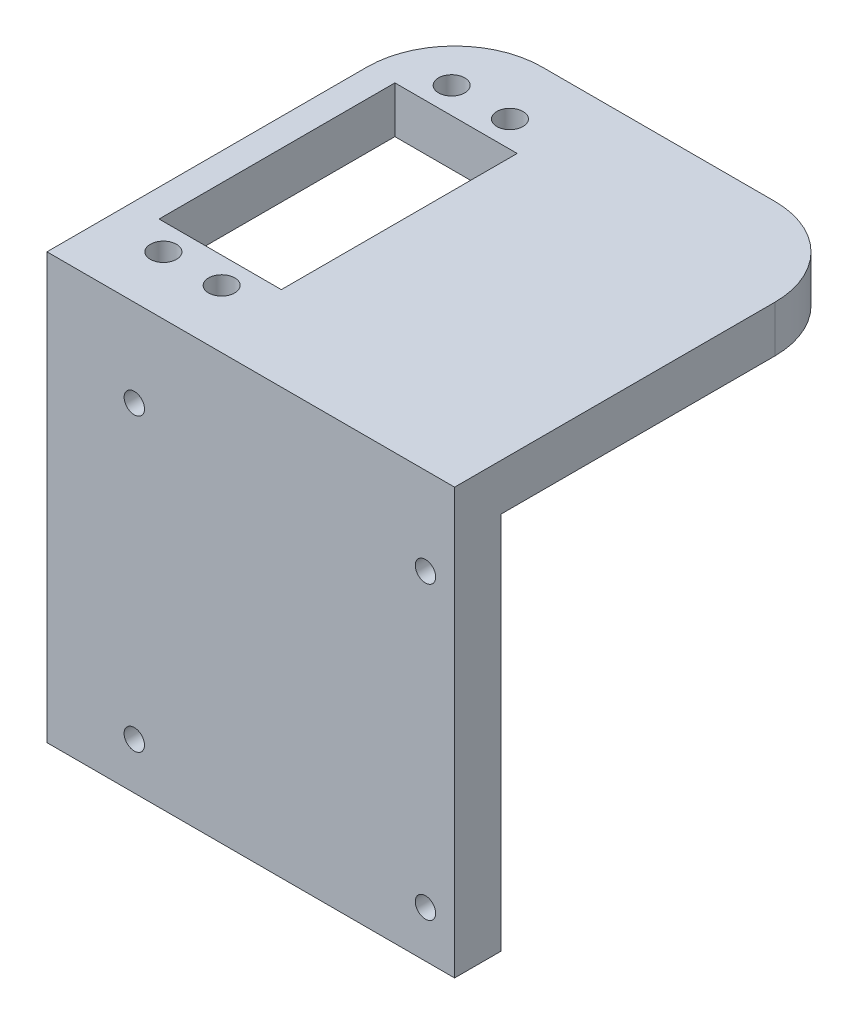
ISO-10303-21;
HEADER;
FILE_DESCRIPTION(('STEP AP214'),'2;1');
FILE_NAME('part.step','',(''),(''),'','','');
FILE_SCHEMA(('AUTOMOTIVE_DESIGN { 1 0 10303 214 1 1 1 1 }'));
ENDSEC;
DATA;
#1=APPLICATION_CONTEXT('core data for automotive mechanical design processes');
#2=APPLICATION_PROTOCOL_DEFINITION('international standard','automotive_design',2000,#1);
#3=PRODUCT_CONTEXT('',#1,'mechanical');
#4=PRODUCT('Part','Part','',(#3));
#5=PRODUCT_RELATED_PRODUCT_CATEGORY('part','',(#4));
#6=PRODUCT_DEFINITION_FORMATION('','',#4);
#7=PRODUCT_DEFINITION_CONTEXT('part definition',#1,'design');
#8=PRODUCT_DEFINITION('design','',#6,#7);
#9=PRODUCT_DEFINITION_SHAPE('','',#8);
#10=(LENGTH_UNIT() NAMED_UNIT(*) SI_UNIT(.MILLI.,.METRE.));
#11=(NAMED_UNIT(*) PLANE_ANGLE_UNIT() SI_UNIT($,.RADIAN.));
#12=(NAMED_UNIT(*) SI_UNIT($,.STERADIAN.) SOLID_ANGLE_UNIT());
#13=UNCERTAINTY_MEASURE_WITH_UNIT(LENGTH_MEASURE(1.E-05),#10,'distance_accuracy_value','');
#14=(GEOMETRIC_REPRESENTATION_CONTEXT(3) GLOBAL_UNCERTAINTY_ASSIGNED_CONTEXT((#13)) GLOBAL_UNIT_ASSIGNED_CONTEXT((#10,
#11,#12)) REPRESENTATION_CONTEXT('',''));
#15=CARTESIAN_POINT('',(0.,0.,0.));
#16=DIRECTION('',(0.,0.,1.));
#17=DIRECTION('',(1.,0.,0.));
#18=AXIS2_PLACEMENT_3D('',#15,#16,#17);
#19=CARTESIAN_POINT('',(50.,-7.,34.5));
#20=DIRECTION('',(0.,0.,-1.));
#21=DIRECTION('',(-1.,0.,0.));
#22=AXIS2_PLACEMENT_3D('',#19,#20,#21);
#23=CYLINDRICAL_SURFACE('',#22,1.75);
#24=CARTESIAN_POINT('',(50.,-7.,32.5));
#25=DIRECTION('',(0.,0.,-1.));
#26=DIRECTION('',(-1.,0.,0.));
#27=AXIS2_PLACEMENT_3D('',#24,#25,#26);
#28=CIRCLE('',#27,1.75);
#29=CARTESIAN_POINT('',(48.25,-7.,32.5));
#30=VERTEX_POINT('',#29);
#31=EDGE_CURVE('E240',#30,#30,#28,.T.);
#32=ORIENTED_EDGE('',*,*,#31,.F.);
#33=EDGE_LOOP('',(#32));
#34=FACE_BOUND('',#33,.T.);
#35=CARTESIAN_POINT('',(50.,-7.,27.5));
#36=DIRECTION('',(0.,0.,-1.));
#37=DIRECTION('',(-1.,0.,0.));
#38=AXIS2_PLACEMENT_3D('',#35,#36,#37);
#39=CIRCLE('',#38,1.75);
#40=CARTESIAN_POINT('',(48.25,-7.,27.5));
#41=VERTEX_POINT('',#40);
#42=EDGE_CURVE('E238',#41,#41,#39,.F.);
#43=ORIENTED_EDGE('',*,*,#42,.F.);
#44=EDGE_LOOP('',(#43));
#45=FACE_BOUND('',#44,.T.);
#46=ADVANCED_FACE('F39',(#34,#45),#23,.F.);
#47=CARTESIAN_POINT('',(0.,-57.,34.5));
#48=DIRECTION('',(0.,0.,-1.));
#49=DIRECTION('',(-1.,0.,0.));
#50=AXIS2_PLACEMENT_3D('',#47,#48,#49);
#51=CYLINDRICAL_SURFACE('',#50,1.75);
#52=CARTESIAN_POINT('',(0.,-57.,32.5));
#53=DIRECTION('',(0.,0.,-1.));
#54=DIRECTION('',(-1.,0.,0.));
#55=AXIS2_PLACEMENT_3D('',#52,#53,#54);
#56=CIRCLE('',#55,1.75);
#57=CARTESIAN_POINT('',(-1.75000000000002,-57.,32.5));
#58=VERTEX_POINT('',#57);
#59=EDGE_CURVE('E244',#58,#58,#56,.T.);
#60=ORIENTED_EDGE('',*,*,#59,.F.);
#61=EDGE_LOOP('',(#60));
#62=FACE_BOUND('',#61,.T.);
#63=CARTESIAN_POINT('',(0.,-57.,27.5));
#64=DIRECTION('',(0.,0.,-1.));
#65=DIRECTION('',(-1.,0.,0.));
#66=AXIS2_PLACEMENT_3D('',#63,#64,#65);
#67=CIRCLE('',#66,1.75);
#68=CARTESIAN_POINT('',(-1.75000000000002,-57.,27.5));
#69=VERTEX_POINT('',#68);
#70=EDGE_CURVE('E236',#69,#69,#67,.F.);
#71=ORIENTED_EDGE('',*,*,#70,.F.);
#72=EDGE_LOOP('',(#71));
#73=FACE_BOUND('',#72,.T.);
#74=ADVANCED_FACE('F293',(#62,#73),#51,.F.);
#75=CARTESIAN_POINT('',(50.,-57.,34.5));
#76=DIRECTION('',(0.,0.,-1.));
#77=DIRECTION('',(-1.,0.,0.));
#78=AXIS2_PLACEMENT_3D('',#75,#76,#77);
#79=CYLINDRICAL_SURFACE('',#78,1.75);
#80=CARTESIAN_POINT('',(50.,-57.,32.5));
#81=DIRECTION('',(0.,0.,-1.));
#82=DIRECTION('',(-1.,0.,0.));
#83=AXIS2_PLACEMENT_3D('',#80,#81,#82);
#84=CIRCLE('',#83,1.75);
#85=CARTESIAN_POINT('',(48.25,-57.,32.5));
#86=VERTEX_POINT('',#85);
#87=EDGE_CURVE('E249',#86,#86,#84,.T.);
#88=ORIENTED_EDGE('',*,*,#87,.F.);
#89=EDGE_LOOP('',(#88));
#90=FACE_BOUND('',#89,.T.);
#91=CARTESIAN_POINT('',(50.,-57.,27.5));
#92=DIRECTION('',(0.,0.,-1.));
#93=DIRECTION('',(-1.,0.,0.));
#94=AXIS2_PLACEMENT_3D('',#91,#92,#93);
#95=CIRCLE('',#94,1.75);
#96=CARTESIAN_POINT('',(48.25,-57.,27.5));
#97=VERTEX_POINT('',#96);
#98=EDGE_CURVE('E232',#97,#97,#95,.F.);
#99=ORIENTED_EDGE('',*,*,#98,.F.);
#100=EDGE_LOOP('',(#99));
#101=FACE_BOUND('',#100,.T.);
#102=ADVANCED_FACE('F300',(#90,#101),#79,.F.);
#103=CARTESIAN_POINT('',(0.,-7.,34.5));
#104=DIRECTION('',(0.,0.,-1.));
#105=DIRECTION('',(-1.,0.,0.));
#106=AXIS2_PLACEMENT_3D('',#103,#104,#105);
#107=CYLINDRICAL_SURFACE('',#106,1.75);
#108=CARTESIAN_POINT('',(0.,-7.,32.5));
#109=DIRECTION('',(0.,0.,-1.));
#110=DIRECTION('',(-1.,0.,0.));
#111=AXIS2_PLACEMENT_3D('',#108,#109,#110);
#112=CIRCLE('',#111,1.75);
#113=CARTESIAN_POINT('',(-1.75000000000001,-7.,32.5));
#114=VERTEX_POINT('',#113);
#115=EDGE_CURVE('E257',#114,#114,#112,.T.);
#116=ORIENTED_EDGE('',*,*,#115,.F.);
#117=EDGE_LOOP('',(#116));
#118=FACE_BOUND('',#117,.T.);
#119=CARTESIAN_POINT('',(0.,-7.,27.5));
#120=DIRECTION('',(0.,0.,-1.));
#121=DIRECTION('',(-1.,0.,0.));
#122=AXIS2_PLACEMENT_3D('',#119,#120,#121);
#123=CIRCLE('',#122,1.75);
#124=CARTESIAN_POINT('',(-1.75000000000001,-7.,27.5));
#125=VERTEX_POINT('',#124);
#126=EDGE_CURVE('E229',#125,#125,#123,.F.);
#127=ORIENTED_EDGE('',*,*,#126,.F.);
#128=EDGE_LOOP('',(#127));
#129=FACE_BOUND('',#128,.T.);
#130=ADVANCED_FACE('F320',(#118,#129),#107,.F.);
#131=CARTESIAN_POINT('',(0.,0.,0.));
#132=DIRECTION('',(0.,1.,0.));
#133=DIRECTION('',(0.,0.,1.));
#134=AXIS2_PLACEMENT_3D('',#131,#132,#133);
#135=PLANE('',#134);
#136=CARTESIAN_POINT('',(5.,0.,-27.));
#137=DIRECTION('',(0.,1.,0.));
#138=DIRECTION('',(0.,0.,1.));
#139=AXIS2_PLACEMENT_3D('',#136,#137,#138);
#140=CIRCLE('',#139,2.25);
#141=CARTESIAN_POINT('',(5.,0.,-24.75));
#142=VERTEX_POINT('',#141);
#143=EDGE_CURVE('E606',#142,#142,#140,.T.);
#144=ORIENTED_EDGE('',*,*,#143,.T.);
#145=EDGE_LOOP('',(#144));
#146=FACE_BOUND('',#145,.T.);
#147=CARTESIAN_POINT('',(-5.,0.,-27.));
#148=DIRECTION('',(0.,1.,0.));
#149=DIRECTION('',(0.,0.,1.));
#150=AXIS2_PLACEMENT_3D('',#147,#148,#149);
#151=CIRCLE('',#150,2.25);
#152=CARTESIAN_POINT('',(-5.,0.,-24.75));
#153=VERTEX_POINT('',#152);
#154=EDGE_CURVE('E608',#153,#153,#151,.T.);
#155=ORIENTED_EDGE('',*,*,#154,.T.);
#156=EDGE_LOOP('',(#155));
#157=FACE_BOUND('',#156,.T.);
#158=DIRECTION('',(-1.,0.,0.));
#159=VECTOR('',#158,1.);
#160=CARTESIAN_POINT('',(0.,0.,-22.5));
#161=LINE('',#160,#159);
#162=CARTESIAN_POINT('',(10.75,0.,-22.5));
#163=VERTEX_POINT('',#162);
#164=CARTESIAN_POINT('',(-10.25,0.,-22.5));
#165=VERTEX_POINT('',#164);
#166=EDGE_CURVE('E640',#163,#165,#161,.T.);
#167=ORIENTED_EDGE('',*,*,#166,.T.);
#168=DIRECTION('',(0.,0.,1.));
#169=VECTOR('',#168,1.);
#170=CARTESIAN_POINT('',(-10.25,0.,0.));
#171=LINE('',#170,#169);
#172=CARTESIAN_POINT('',(-10.25,0.,18.));
#173=VERTEX_POINT('',#172);
#174=EDGE_CURVE('E643',#165,#173,#171,.T.);
#175=ORIENTED_EDGE('',*,*,#174,.T.);
#176=DIRECTION('',(1.,0.,0.));
#177=VECTOR('',#176,1.);
#178=CARTESIAN_POINT('',(0.,0.,18.));
#179=LINE('',#178,#177);
#180=CARTESIAN_POINT('',(10.75,0.,18.));
#181=VERTEX_POINT('',#180);
#182=EDGE_CURVE('E628',#173,#181,#179,.T.);
#183=ORIENTED_EDGE('',*,*,#182,.T.);
#184=DIRECTION('',(0.,0.,-1.));
#185=VECTOR('',#184,1.);
#186=CARTESIAN_POINT('',(10.75,0.,0.));
#187=LINE('',#186,#185);
#188=EDGE_CURVE('E637',#181,#163,#187,.T.);
#189=ORIENTED_EDGE('',*,*,#188,.T.);
#190=EDGE_LOOP('',(#167,#175,#183,#189));
#191=FACE_BOUND('',#190,.T.);
#192=DIRECTION('',(0.,0.,1.));
#193=VECTOR('',#192,1.);
#194=CARTESIAN_POINT('',(-15.,0.,-37.5));
#195=LINE('',#194,#193);
#196=CARTESIAN_POINT('',(-15.,0.,-22.5));
#197=VERTEX_POINT('',#196);
#198=CARTESIAN_POINT('',(-15.,0.,24.5));
#199=VERTEX_POINT('',#198);
#200=EDGE_CURVE('E202',#197,#199,#195,.T.);
#201=ORIENTED_EDGE('',*,*,#200,.F.);
#202=CARTESIAN_POINT('',(0.,0.,-22.5));
#203=DIRECTION('',(0.,1.,0.));
#204=DIRECTION('',(0.,0.,1.));
#205=AXIS2_PLACEMENT_3D('',#202,#203,#204);
#206=CIRCLE('',#205,15.);
#207=CARTESIAN_POINT('',(0.,0.,-37.5));
#208=VERTEX_POINT('',#207);
#209=EDGE_CURVE('E61',#197,#208,#206,.F.);
#210=ORIENTED_EDGE('',*,*,#209,.T.);
#211=DIRECTION('',(-1.,0.,0.));
#212=VECTOR('',#211,1.);
#213=CARTESIAN_POINT('',(-15.,0.,-37.5));
#214=LINE('',#213,#212);
#215=CARTESIAN_POINT('',(40.,0.,-37.5));
#216=VERTEX_POINT('',#215);
#217=EDGE_CURVE('E217',#216,#208,#214,.T.);
#218=ORIENTED_EDGE('',*,*,#217,.F.);
#219=CARTESIAN_POINT('',(40.,0.,-22.5));
#220=DIRECTION('',(0.,1.,0.));
#221=DIRECTION('',(0.,0.,1.));
#222=AXIS2_PLACEMENT_3D('',#219,#220,#221);
#223=CIRCLE('',#222,15.);
#224=CARTESIAN_POINT('',(55.,0.,-22.5));
#225=VERTEX_POINT('',#224);
#226=EDGE_CURVE('E188',#216,#225,#223,.F.);
#227=ORIENTED_EDGE('',*,*,#226,.T.);
#228=DIRECTION('',(0.,0.,-1.));
#229=VECTOR('',#228,1.);
#230=CARTESIAN_POINT('',(55.,0.,-37.5));
#231=LINE('',#230,#229);
#232=CARTESIAN_POINT('',(55.,0.,24.5));
#233=VERTEX_POINT('',#232);
#234=EDGE_CURVE('E213',#233,#225,#231,.T.);
#235=ORIENTED_EDGE('',*,*,#234,.F.);
#236=DIRECTION('',(1.,0.,0.));
#237=VECTOR('',#236,1.);
#238=CARTESIAN_POINT('',(-15.,0.,24.5));
#239=LINE('',#238,#237);
#240=CARTESIAN_POINT('',(6.03077640640444,0.,24.5));
#241=VERTEX_POINT('',#240);
#242=EDGE_CURVE('E260',#241,#233,#239,.T.);
#243=ORIENTED_EDGE('',*,*,#242,.F.);
#244=CARTESIAN_POINT('',(5.,0.,22.5));
#245=DIRECTION('',(0.,1.,0.));
#246=DIRECTION('',(0.,0.,1.));
#247=AXIS2_PLACEMENT_3D('',#244,#245,#246);
#248=CIRCLE('',#247,2.25);
#249=CARTESIAN_POINT('',(3.96922359359557,0.,24.5));
#250=VERTEX_POINT('',#249);
#251=EDGE_CURVE('E700',#241,#250,#248,.T.);
#252=ORIENTED_EDGE('',*,*,#251,.T.);
#253=CARTESIAN_POINT('',(-3.96922359359557,0.,24.5));
#254=VERTEX_POINT('',#253);
#255=EDGE_CURVE('E173',#254,#250,#239,.T.);
#256=ORIENTED_EDGE('',*,*,#255,.F.);
#257=CARTESIAN_POINT('',(-5.,0.,22.5));
#258=DIRECTION('',(0.,1.,0.));
#259=DIRECTION('',(0.,0.,1.));
#260=AXIS2_PLACEMENT_3D('',#257,#258,#259);
#261=CIRCLE('',#260,2.25);
#262=CARTESIAN_POINT('',(-6.03077640640443,0.,24.5));
#263=VERTEX_POINT('',#262);
#264=EDGE_CURVE('E613',#254,#263,#261,.T.);
#265=ORIENTED_EDGE('',*,*,#264,.T.);
#266=EDGE_CURVE('E211',#199,#263,#239,.T.);
#267=ORIENTED_EDGE('',*,*,#266,.F.);
#268=EDGE_LOOP('',(#201,#210,#218,#227,#235,#243,#252,#256,#265,#267));
#269=FACE_BOUND('',#268,.T.);
#270=ADVANCED_FACE('F208',(#146,#157,#191,#269),#135,.F.);
#271=CARTESIAN_POINT('',(-15.,8.,-37.5));
#272=DIRECTION('',(1.,0.,0.));
#273=DIRECTION('',(0.,0.,-1.));
#274=AXIS2_PLACEMENT_3D('',#271,#272,#273);
#275=PLANE('',#274);
#276=DIRECTION('',(0.,0.,1.));
#277=VECTOR('',#276,1.);
#278=CARTESIAN_POINT('',(-15.,8.,-37.5));
#279=LINE('',#278,#277);
#280=CARTESIAN_POINT('',(-15.,8.,-22.5));
#281=VERTEX_POINT('',#280);
#282=CARTESIAN_POINT('',(-15.,8.,32.5));
#283=VERTEX_POINT('',#282);
#284=EDGE_CURVE('E205',#281,#283,#279,.T.);
#285=ORIENTED_EDGE('',*,*,#284,.F.);
#286=DIRECTION('',(0.,-1.,0.));
#287=VECTOR('',#286,1.);
#288=CARTESIAN_POINT('',(-15.,8.,-22.5));
#289=LINE('',#288,#287);
#290=EDGE_CURVE('E194',#281,#197,#289,.T.);
#291=ORIENTED_EDGE('',*,*,#290,.T.);
#292=ORIENTED_EDGE('',*,*,#200,.T.);
#293=DIRECTION('',(0.,1.,0.));
#294=VECTOR('',#293,1.);
#295=CARTESIAN_POINT('',(-15.,-65.,24.5));
#296=LINE('',#295,#294);
#297=CARTESIAN_POINT('',(-15.,-65.,24.5));
#298=VERTEX_POINT('',#297);
#299=EDGE_CURVE('E214',#298,#199,#296,.T.);
#300=ORIENTED_EDGE('',*,*,#299,.F.);
#301=DIRECTION('',(0.,0.,-1.));
#302=VECTOR('',#301,1.);
#303=CARTESIAN_POINT('',(-15.,-65.,32.5));
#304=LINE('',#303,#302);
#305=CARTESIAN_POINT('',(-15.,-65.,32.5));
#306=VERTEX_POINT('',#305);
#307=EDGE_CURVE('E261',#306,#298,#304,.T.);
#308=ORIENTED_EDGE('',*,*,#307,.F.);
#309=DIRECTION('',(0.,-1.,0.));
#310=VECTOR('',#309,1.);
#311=CARTESIAN_POINT('',(-15.,8.,32.5));
#312=LINE('',#311,#310);
#313=EDGE_CURVE('E160',#283,#306,#312,.T.);
#314=ORIENTED_EDGE('',*,*,#313,.F.);
#315=EDGE_LOOP('',(#285,#291,#292,#300,#308,#314));
#316=FACE_BOUND('',#315,.T.);
#317=ADVANCED_FACE('F200',(#316),#275,.F.);
#318=CARTESIAN_POINT('',(-15.,8.,32.5));
#319=DIRECTION('',(0.,0.,-1.));
#320=DIRECTION('',(-1.,0.,0.));
#321=AXIS2_PLACEMENT_3D('',#318,#319,#320);
#322=PLANE('',#321);
#323=ORIENTED_EDGE('',*,*,#115,.T.);
#324=EDGE_LOOP('',(#323));
#325=FACE_BOUND('',#324,.T.);
#326=ORIENTED_EDGE('',*,*,#87,.T.);
#327=EDGE_LOOP('',(#326));
#328=FACE_BOUND('',#327,.T.);
#329=ORIENTED_EDGE('',*,*,#59,.T.);
#330=EDGE_LOOP('',(#329));
#331=FACE_BOUND('',#330,.T.);
#332=ORIENTED_EDGE('',*,*,#31,.T.);
#333=EDGE_LOOP('',(#332));
#334=FACE_BOUND('',#333,.T.);
#335=ORIENTED_EDGE('',*,*,#313,.T.);
#336=DIRECTION('',(-1.,0.,0.));
#337=VECTOR('',#336,1.);
#338=CARTESIAN_POINT('',(-15.,-65.,32.5));
#339=LINE('',#338,#337);
#340=CARTESIAN_POINT('',(55.,-65.,32.5));
#341=VERTEX_POINT('',#340);
#342=EDGE_CURVE('E269',#341,#306,#339,.T.);
#343=ORIENTED_EDGE('',*,*,#342,.F.);
#344=DIRECTION('',(0.,-1.,0.));
#345=VECTOR('',#344,1.);
#346=CARTESIAN_POINT('',(55.,8.,32.5));
#347=LINE('',#346,#345);
#348=CARTESIAN_POINT('',(55.,8.,32.5));
#349=VERTEX_POINT('',#348);
#350=EDGE_CURVE('E226',#349,#341,#347,.T.);
#351=ORIENTED_EDGE('',*,*,#350,.F.);
#352=DIRECTION('',(1.,0.,0.));
#353=VECTOR('',#352,1.);
#354=CARTESIAN_POINT('',(-15.,8.,32.5));
#355=LINE('',#354,#353);
#356=EDGE_CURVE('E276',#283,#349,#355,.T.);
#357=ORIENTED_EDGE('',*,*,#356,.F.);
#358=EDGE_LOOP('',(#335,#343,#351,#357));
#359=FACE_BOUND('',#358,.T.);
#360=ADVANCED_FACE('F327',(#325,#328,#331,#334,#359),#322,.F.);
#361=CARTESIAN_POINT('',(55.,8.,-37.5));
#362=DIRECTION('',(-1.,0.,0.));
#363=DIRECTION('',(0.,0.,1.));
#364=AXIS2_PLACEMENT_3D('',#361,#362,#363);
#365=PLANE('',#364);
#366=ORIENTED_EDGE('',*,*,#234,.T.);
#367=DIRECTION('',(0.,-1.,0.));
#368=VECTOR('',#367,1.);
#369=CARTESIAN_POINT('',(55.,8.,-22.5));
#370=LINE('',#369,#368);
#371=CARTESIAN_POINT('',(55.,8.,-22.5));
#372=VERTEX_POINT('',#371);
#373=EDGE_CURVE('E190',#225,#372,#370,.F.);
#374=ORIENTED_EDGE('',*,*,#373,.T.);
#375=DIRECTION('',(0.,0.,-1.));
#376=VECTOR('',#375,1.);
#377=CARTESIAN_POINT('',(55.,8.,-37.5));
#378=LINE('',#377,#376);
#379=EDGE_CURVE('E277',#349,#372,#378,.T.);
#380=ORIENTED_EDGE('',*,*,#379,.F.);
#381=ORIENTED_EDGE('',*,*,#350,.T.);
#382=DIRECTION('',(0.,0.,1.));
#383=VECTOR('',#382,1.);
#384=CARTESIAN_POINT('',(55.,-65.,32.5));
#385=LINE('',#384,#383);
#386=CARTESIAN_POINT('',(55.,-65.,24.5));
#387=VERTEX_POINT('',#386);
#388=EDGE_CURVE('E266',#387,#341,#385,.T.);
#389=ORIENTED_EDGE('',*,*,#388,.F.);
#390=DIRECTION('',(0.,1.,0.));
#391=VECTOR('',#390,1.);
#392=CARTESIAN_POINT('',(55.,-65.,24.5));
#393=LINE('',#392,#391);
#394=EDGE_CURVE('E219',#387,#233,#393,.T.);
#395=ORIENTED_EDGE('',*,*,#394,.T.);
#396=EDGE_LOOP('',(#366,#374,#380,#381,#389,#395));
#397=FACE_BOUND('',#396,.T.);
#398=ADVANCED_FACE('F324',(#397),#365,.F.);
#399=CARTESIAN_POINT('',(-15.,8.,-37.5));
#400=DIRECTION('',(0.,0.,1.));
#401=DIRECTION('',(1.,0.,0.));
#402=AXIS2_PLACEMENT_3D('',#399,#400,#401);
#403=PLANE('',#402);
#404=ORIENTED_EDGE('',*,*,#217,.T.);
#405=DIRECTION('',(0.,-1.,0.));
#406=VECTOR('',#405,1.);
#407=CARTESIAN_POINT('',(0.,8.,-37.5));
#408=LINE('',#407,#406);
#409=CARTESIAN_POINT('',(0.,8.,-37.5));
#410=VERTEX_POINT('',#409);
#411=EDGE_CURVE('E47',#208,#410,#408,.F.);
#412=ORIENTED_EDGE('',*,*,#411,.T.);
#413=DIRECTION('',(-1.,0.,0.));
#414=VECTOR('',#413,1.);
#415=CARTESIAN_POINT('',(-15.,8.,-37.5));
#416=LINE('',#415,#414);
#417=CARTESIAN_POINT('',(40.,8.,-37.5));
#418=VERTEX_POINT('',#417);
#419=EDGE_CURVE('E222',#418,#410,#416,.T.);
#420=ORIENTED_EDGE('',*,*,#419,.F.);
#421=DIRECTION('',(0.,-1.,0.));
#422=VECTOR('',#421,1.);
#423=CARTESIAN_POINT('',(40.,8.,-37.5));
#424=LINE('',#423,#422);
#425=EDGE_CURVE('E185',#418,#216,#424,.T.);
#426=ORIENTED_EDGE('',*,*,#425,.T.);
#427=EDGE_LOOP('',(#404,#412,#420,#426));
#428=FACE_BOUND('',#427,.T.);
#429=ADVANCED_FACE('F316',(#428),#403,.F.);
#430=CARTESIAN_POINT('',(0.,8.,0.));
#431=DIRECTION('',(0.,1.,0.));
#432=DIRECTION('',(0.,0.,1.));
#433=AXIS2_PLACEMENT_3D('',#430,#431,#432);
#434=PLANE('',#433);
#435=CARTESIAN_POINT('',(5.,8.,-27.));
#436=DIRECTION('',(0.,1.,0.));
#437=DIRECTION('',(0.,0.,1.));
#438=AXIS2_PLACEMENT_3D('',#435,#436,#437);
#439=CIRCLE('',#438,2.25);
#440=CARTESIAN_POINT('',(5.,8.,-24.75));
#441=VERTEX_POINT('',#440);
#442=EDGE_CURVE('E603',#441,#441,#439,.T.);
#443=ORIENTED_EDGE('',*,*,#442,.F.);
#444=EDGE_LOOP('',(#443));
#445=FACE_BOUND('',#444,.T.);
#446=CARTESIAN_POINT('',(-5.,8.,22.5));
#447=DIRECTION('',(0.,1.,0.));
#448=DIRECTION('',(0.,0.,1.));
#449=AXIS2_PLACEMENT_3D('',#446,#447,#448);
#450=CIRCLE('',#449,2.25);
#451=CARTESIAN_POINT('',(-5.,8.,24.75));
#452=VERTEX_POINT('',#451);
#453=EDGE_CURVE('E707',#452,#452,#450,.T.);
#454=ORIENTED_EDGE('',*,*,#453,.F.);
#455=EDGE_LOOP('',(#454));
#456=FACE_BOUND('',#455,.T.);
#457=CARTESIAN_POINT('',(5.,8.,22.5));
#458=DIRECTION('',(0.,1.,0.));
#459=DIRECTION('',(0.,0.,1.));
#460=AXIS2_PLACEMENT_3D('',#457,#458,#459);
#461=CIRCLE('',#460,2.25);
#462=CARTESIAN_POINT('',(5.,8.,24.75));
#463=VERTEX_POINT('',#462);
#464=EDGE_CURVE('E166',#463,#463,#461,.T.);
#465=ORIENTED_EDGE('',*,*,#464,.F.);
#466=EDGE_LOOP('',(#465));
#467=FACE_BOUND('',#466,.T.);
#468=CARTESIAN_POINT('',(-5.,8.,-27.));
#469=DIRECTION('',(0.,1.,0.));
#470=DIRECTION('',(0.,0.,1.));
#471=AXIS2_PLACEMENT_3D('',#468,#469,#470);
#472=CIRCLE('',#471,2.25);
#473=CARTESIAN_POINT('',(-5.,8.,-24.75));
#474=VERTEX_POINT('',#473);
#475=EDGE_CURVE('E702',#474,#474,#472,.T.);
#476=ORIENTED_EDGE('',*,*,#475,.F.);
#477=EDGE_LOOP('',(#476));
#478=FACE_BOUND('',#477,.T.);
#479=DIRECTION('',(0.,0.,1.));
#480=VECTOR('',#479,1.);
#481=CARTESIAN_POINT('',(-10.25,8.,-22.5));
#482=LINE('',#481,#480);
#483=CARTESIAN_POINT('',(-10.25,8.,-22.5));
#484=VERTEX_POINT('',#483);
#485=CARTESIAN_POINT('',(-10.25,8.,18.));
#486=VERTEX_POINT('',#485);
#487=EDGE_CURVE('E607',#484,#486,#482,.T.);
#488=ORIENTED_EDGE('',*,*,#487,.F.);
#489=DIRECTION('',(-1.,0.,0.));
#490=VECTOR('',#489,1.);
#491=CARTESIAN_POINT('',(-10.25,8.,-22.5));
#492=LINE('',#491,#490);
#493=CARTESIAN_POINT('',(10.75,8.,-22.5));
#494=VERTEX_POINT('',#493);
#495=EDGE_CURVE('E622',#494,#484,#492,.T.);
#496=ORIENTED_EDGE('',*,*,#495,.F.);
#497=DIRECTION('',(0.,0.,-1.));
#498=VECTOR('',#497,1.);
#499=CARTESIAN_POINT('',(10.75,8.,-22.5));
#500=LINE('',#499,#498);
#501=CARTESIAN_POINT('',(10.75,8.,18.));
#502=VERTEX_POINT('',#501);
#503=EDGE_CURVE('E619',#502,#494,#500,.T.);
#504=ORIENTED_EDGE('',*,*,#503,.F.);
#505=DIRECTION('',(1.,0.,0.));
#506=VECTOR('',#505,1.);
#507=CARTESIAN_POINT('',(-10.25,8.,18.));
#508=LINE('',#507,#506);
#509=EDGE_CURVE('E610',#486,#502,#508,.T.);
#510=ORIENTED_EDGE('',*,*,#509,.F.);
#511=EDGE_LOOP('',(#488,#496,#504,#510));
#512=FACE_BOUND('',#511,.T.);
#513=ORIENTED_EDGE('',*,*,#419,.T.);
#514=CARTESIAN_POINT('',(0.,8.,-22.5));
#515=DIRECTION('',(0.,1.,0.));
#516=DIRECTION('',(0.,0.,1.));
#517=AXIS2_PLACEMENT_3D('',#514,#515,#516);
#518=CIRCLE('',#517,15.);
#519=EDGE_CURVE('E11',#410,#281,#518,.T.);
#520=ORIENTED_EDGE('',*,*,#519,.T.);
#521=ORIENTED_EDGE('',*,*,#284,.T.);
#522=ORIENTED_EDGE('',*,*,#356,.T.);
#523=ORIENTED_EDGE('',*,*,#379,.T.);
#524=CARTESIAN_POINT('',(40.,8.,-22.5));
#525=DIRECTION('',(0.,1.,0.));
#526=DIRECTION('',(0.,0.,1.));
#527=AXIS2_PLACEMENT_3D('',#524,#525,#526);
#528=CIRCLE('',#527,15.);
#529=EDGE_CURVE('E192',#372,#418,#528,.T.);
#530=ORIENTED_EDGE('',*,*,#529,.T.);
#531=EDGE_LOOP('',(#513,#520,#521,#522,#523,#530));
#532=FACE_BOUND('',#531,.T.);
#533=ADVANCED_FACE('F282',(#445,#456,#467,#478,#512,#532),#434,.T.);
#534=CARTESIAN_POINT('',(-15.,-65.,24.5));
#535=DIRECTION('',(0.,0.,1.));
#536=DIRECTION('',(1.,0.,0.));
#537=AXIS2_PLACEMENT_3D('',#534,#535,#536);
#538=PLANE('',#537);
#539=CARTESIAN_POINT('',(50.,-57.,24.5));
#540=DIRECTION('',(0.,0.,-1.));
#541=DIRECTION('',(-1.,0.,0.));
#542=AXIS2_PLACEMENT_3D('',#539,#540,#541);
#543=CIRCLE('',#542,3.5);
#544=CARTESIAN_POINT('',(46.5,-57.,24.5));
#545=VERTEX_POINT('',#544);
#546=EDGE_CURVE('E659',#545,#545,#543,.T.);
#547=ORIENTED_EDGE('',*,*,#546,.F.);
#548=EDGE_LOOP('',(#547));
#549=FACE_BOUND('',#548,.T.);
#550=CARTESIAN_POINT('',(0.,-57.,24.5));
#551=DIRECTION('',(0.,0.,-1.));
#552=DIRECTION('',(-1.,0.,0.));
#553=AXIS2_PLACEMENT_3D('',#550,#551,#552);
#554=CIRCLE('',#553,3.49999999999999);
#555=CARTESIAN_POINT('',(-3.50000000000001,-57.,24.5));
#556=VERTEX_POINT('',#555);
#557=EDGE_CURVE('E653',#556,#556,#554,.T.);
#558=ORIENTED_EDGE('',*,*,#557,.F.);
#559=EDGE_LOOP('',(#558));
#560=FACE_BOUND('',#559,.T.);
#561=CARTESIAN_POINT('',(0.,-7.,24.5));
#562=DIRECTION('',(0.,0.,-1.));
#563=DIRECTION('',(-1.,0.,0.));
#564=AXIS2_PLACEMENT_3D('',#561,#562,#563);
#565=CIRCLE('',#564,3.5);
#566=CARTESIAN_POINT('',(-3.50000000000001,-7.,24.5));
#567=VERTEX_POINT('',#566);
#568=EDGE_CURVE('E647',#567,#567,#565,.T.);
#569=ORIENTED_EDGE('',*,*,#568,.F.);
#570=EDGE_LOOP('',(#569));
#571=FACE_BOUND('',#570,.T.);
#572=CARTESIAN_POINT('',(50.,-7.,24.5));
#573=DIRECTION('',(0.,0.,-1.));
#574=DIRECTION('',(-1.,0.,0.));
#575=AXIS2_PLACEMENT_3D('',#572,#573,#574);
#576=CIRCLE('',#575,3.5);
#577=CARTESIAN_POINT('',(46.5,-7.,24.5));
#578=VERTEX_POINT('',#577);
#579=EDGE_CURVE('E252',#578,#578,#576,.T.);
#580=ORIENTED_EDGE('',*,*,#579,.F.);
#581=EDGE_LOOP('',(#580));
#582=FACE_BOUND('',#581,.T.);
#583=DIRECTION('',(-1.,0.,0.));
#584=VECTOR('',#583,1.);
#585=CARTESIAN_POINT('',(-15.,-2.,24.5));
#586=LINE('',#585,#584);
#587=CARTESIAN_POINT('',(-3.96922359359557,-2.,24.5));
#588=VERTEX_POINT('',#587);
#589=CARTESIAN_POINT('',(-6.03077640640443,-2.,24.5));
#590=VERTEX_POINT('',#589);
#591=EDGE_CURVE('E175',#588,#590,#586,.T.);
#592=ORIENTED_EDGE('',*,*,#591,.F.);
#593=DIRECTION('',(0.,1.,0.));
#594=VECTOR('',#593,1.);
#595=CARTESIAN_POINT('',(-3.96922359359557,-2.,24.5));
#596=LINE('',#595,#594);
#597=EDGE_CURVE('E183',#588,#254,#596,.T.);
#598=ORIENTED_EDGE('',*,*,#597,.T.);
#599=ORIENTED_EDGE('',*,*,#255,.T.);
#600=DIRECTION('',(0.,1.,0.));
#601=VECTOR('',#600,1.);
#602=CARTESIAN_POINT('',(3.96922359359557,-2.,24.5));
#603=LINE('',#602,#601);
#604=CARTESIAN_POINT('',(3.96922359359557,-2.,24.5));
#605=VERTEX_POINT('',#604);
#606=EDGE_CURVE('E159',#250,#605,#603,.F.);
#607=ORIENTED_EDGE('',*,*,#606,.T.);
#608=DIRECTION('',(-1.,0.,0.));
#609=VECTOR('',#608,1.);
#610=CARTESIAN_POINT('',(-15.,-2.,24.5));
#611=LINE('',#610,#609);
#612=CARTESIAN_POINT('',(6.03077640640444,-2.,24.5));
#613=VERTEX_POINT('',#612);
#614=EDGE_CURVE('E151',#613,#605,#611,.T.);
#615=ORIENTED_EDGE('',*,*,#614,.F.);
#616=DIRECTION('',(0.,1.,0.));
#617=VECTOR('',#616,1.);
#618=CARTESIAN_POINT('',(6.03077640640443,-2.,24.5));
#619=LINE('',#618,#617);
#620=EDGE_CURVE('E165',#613,#241,#619,.T.);
#621=ORIENTED_EDGE('',*,*,#620,.T.);
#622=ORIENTED_EDGE('',*,*,#242,.T.);
#623=ORIENTED_EDGE('',*,*,#394,.F.);
#624=DIRECTION('',(1.,0.,0.));
#625=VECTOR('',#624,1.);
#626=CARTESIAN_POINT('',(-15.,-65.,24.5));
#627=LINE('',#626,#625);
#628=EDGE_CURVE('E264',#298,#387,#627,.T.);
#629=ORIENTED_EDGE('',*,*,#628,.F.);
#630=ORIENTED_EDGE('',*,*,#299,.T.);
#631=ORIENTED_EDGE('',*,*,#266,.T.);
#632=DIRECTION('',(0.,1.,0.));
#633=VECTOR('',#632,1.);
#634=CARTESIAN_POINT('',(-6.03077640640443,-2.,24.5));
#635=LINE('',#634,#633);
#636=EDGE_CURVE('E180',#263,#590,#635,.F.);
#637=ORIENTED_EDGE('',*,*,#636,.T.);
#638=EDGE_LOOP('',(#592,#598,#599,#607,#615,#621,#622,#623,#629,#630,#631,#637));
#639=FACE_BOUND('',#638,.T.);
#640=ADVANCED_FACE('F170',(#549,#560,#571,#582,#639),#538,.F.);
#641=CARTESIAN_POINT('',(0.,-65.,0.));
#642=DIRECTION('',(0.,-1.,0.));
#643=DIRECTION('',(0.,0.,-1.));
#644=AXIS2_PLACEMENT_3D('',#641,#642,#643);
#645=PLANE('',#644);
#646=ORIENTED_EDGE('',*,*,#307,.T.);
#647=ORIENTED_EDGE('',*,*,#628,.T.);
#648=ORIENTED_EDGE('',*,*,#388,.T.);
#649=ORIENTED_EDGE('',*,*,#342,.T.);
#650=EDGE_LOOP('',(#646,#647,#648,#649));
#651=FACE_BOUND('',#650,.T.);
#652=ADVANCED_FACE('F307',(#651),#645,.T.);
#653=CARTESIAN_POINT('',(0.,-7.,27.5));
#654=DIRECTION('',(0.,0.,-1.));
#655=DIRECTION('',(-1.,0.,0.));
#656=AXIS2_PLACEMENT_3D('',#653,#654,#655);
#657=PLANE('',#656);
#658=CARTESIAN_POINT('',(0.,-7.,27.5));
#659=DIRECTION('',(0.,0.,-1.));
#660=DIRECTION('',(-1.,0.,0.));
#661=AXIS2_PLACEMENT_3D('',#658,#659,#660);
#662=CIRCLE('',#661,3.5);
#663=CARTESIAN_POINT('',(-3.50000000000001,-7.,27.5));
#664=VERTEX_POINT('',#663);
#665=EDGE_CURVE('E650',#664,#664,#662,.T.);
#666=ORIENTED_EDGE('',*,*,#665,.T.);
#667=EDGE_LOOP('',(#666));
#668=FACE_BOUND('',#667,.T.);
#669=ORIENTED_EDGE('',*,*,#126,.T.);
#670=EDGE_LOOP('',(#669));
#671=FACE_BOUND('',#670,.T.);
#672=ADVANCED_FACE('F310',(#668,#671),#657,.T.);
#673=CARTESIAN_POINT('',(0.,-7.,27.5));
#674=DIRECTION('',(0.,0.,-1.));
#675=DIRECTION('',(-1.,0.,0.));
#676=AXIS2_PLACEMENT_3D('',#673,#674,#675);
#677=CYLINDRICAL_SURFACE('',#676,3.5);
#678=ORIENTED_EDGE('',*,*,#665,.F.);
#679=EDGE_LOOP('',(#678));
#680=FACE_BOUND('',#679,.T.);
#681=ORIENTED_EDGE('',*,*,#568,.T.);
#682=EDGE_LOOP('',(#681));
#683=FACE_BOUND('',#682,.T.);
#684=ADVANCED_FACE('F398',(#680,#683),#677,.F.);
#685=CARTESIAN_POINT('',(50.,-57.,27.5));
#686=DIRECTION('',(0.,0.,-1.));
#687=DIRECTION('',(-1.,0.,0.));
#688=AXIS2_PLACEMENT_3D('',#685,#686,#687);
#689=PLANE('',#688);
#690=CARTESIAN_POINT('',(50.,-57.,27.5));
#691=DIRECTION('',(0.,0.,-1.));
#692=DIRECTION('',(-1.,0.,0.));
#693=AXIS2_PLACEMENT_3D('',#690,#691,#692);
#694=CIRCLE('',#693,3.5);
#695=CARTESIAN_POINT('',(46.5,-57.,27.5));
#696=VERTEX_POINT('',#695);
#697=EDGE_CURVE('E646',#696,#696,#694,.T.);
#698=ORIENTED_EDGE('',*,*,#697,.T.);
#699=EDGE_LOOP('',(#698));
#700=FACE_BOUND('',#699,.T.);
#701=ORIENTED_EDGE('',*,*,#98,.T.);
#702=EDGE_LOOP('',(#701));
#703=FACE_BOUND('',#702,.T.);
#704=ADVANCED_FACE('F407',(#700,#703),#689,.T.);
#705=CARTESIAN_POINT('',(50.,-57.,27.5));
#706=DIRECTION('',(0.,0.,-1.));
#707=DIRECTION('',(-1.,0.,0.));
#708=AXIS2_PLACEMENT_3D('',#705,#706,#707);
#709=CYLINDRICAL_SURFACE('',#708,3.5);
#710=ORIENTED_EDGE('',*,*,#697,.F.);
#711=EDGE_LOOP('',(#710));
#712=FACE_BOUND('',#711,.T.);
#713=ORIENTED_EDGE('',*,*,#546,.T.);
#714=EDGE_LOOP('',(#713));
#715=FACE_BOUND('',#714,.T.);
#716=ADVANCED_FACE('F416',(#712,#715),#709,.F.);
#717=CARTESIAN_POINT('',(0.,-57.,27.5));
#718=DIRECTION('',(0.,0.,-1.));
#719=DIRECTION('',(-1.,0.,0.));
#720=AXIS2_PLACEMENT_3D('',#717,#718,#719);
#721=PLANE('',#720);
#722=CARTESIAN_POINT('',(0.,-57.,27.5));
#723=DIRECTION('',(0.,0.,-1.));
#724=DIRECTION('',(-1.,0.,0.));
#725=AXIS2_PLACEMENT_3D('',#722,#723,#724);
#726=CIRCLE('',#725,3.49999999999999);
#727=CARTESIAN_POINT('',(-3.50000000000001,-57.,27.5));
#728=VERTEX_POINT('',#727);
#729=EDGE_CURVE('E656',#728,#728,#726,.T.);
#730=ORIENTED_EDGE('',*,*,#729,.T.);
#731=EDGE_LOOP('',(#730));
#732=FACE_BOUND('',#731,.T.);
#733=ORIENTED_EDGE('',*,*,#70,.T.);
#734=EDGE_LOOP('',(#733));
#735=FACE_BOUND('',#734,.T.);
#736=ADVANCED_FACE('F425',(#732,#735),#721,.T.);
#737=CARTESIAN_POINT('',(0.,-57.,27.5));
#738=DIRECTION('',(0.,0.,-1.));
#739=DIRECTION('',(-1.,0.,0.));
#740=AXIS2_PLACEMENT_3D('',#737,#738,#739);
#741=CYLINDRICAL_SURFACE('',#740,3.49999999999999);
#742=ORIENTED_EDGE('',*,*,#729,.F.);
#743=EDGE_LOOP('',(#742));
#744=FACE_BOUND('',#743,.T.);
#745=ORIENTED_EDGE('',*,*,#557,.T.);
#746=EDGE_LOOP('',(#745));
#747=FACE_BOUND('',#746,.T.);
#748=ADVANCED_FACE('F434',(#744,#747),#741,.F.);
#749=CARTESIAN_POINT('',(50.,-7.,27.5));
#750=DIRECTION('',(0.,0.,-1.));
#751=DIRECTION('',(-1.,0.,0.));
#752=AXIS2_PLACEMENT_3D('',#749,#750,#751);
#753=PLANE('',#752);
#754=CARTESIAN_POINT('',(50.,-7.,27.5));
#755=DIRECTION('',(0.,0.,-1.));
#756=DIRECTION('',(-1.,0.,0.));
#757=AXIS2_PLACEMENT_3D('',#754,#755,#756);
#758=CIRCLE('',#757,3.5);
#759=CARTESIAN_POINT('',(46.5,-7.,27.5));
#760=VERTEX_POINT('',#759);
#761=EDGE_CURVE('E233',#760,#760,#758,.T.);
#762=ORIENTED_EDGE('',*,*,#761,.T.);
#763=EDGE_LOOP('',(#762));
#764=FACE_BOUND('',#763,.T.);
#765=ORIENTED_EDGE('',*,*,#42,.T.);
#766=EDGE_LOOP('',(#765));
#767=FACE_BOUND('',#766,.T.);
#768=ADVANCED_FACE('F443',(#764,#767),#753,.T.);
#769=CARTESIAN_POINT('',(50.,-7.,27.5));
#770=DIRECTION('',(0.,0.,-1.));
#771=DIRECTION('',(-1.,0.,0.));
#772=AXIS2_PLACEMENT_3D('',#769,#770,#771);
#773=CYLINDRICAL_SURFACE('',#772,3.5);
#774=ORIENTED_EDGE('',*,*,#761,.F.);
#775=EDGE_LOOP('',(#774));
#776=FACE_BOUND('',#775,.T.);
#777=ORIENTED_EDGE('',*,*,#579,.T.);
#778=EDGE_LOOP('',(#777));
#779=FACE_BOUND('',#778,.T.);
#780=ADVANCED_FACE('F452',(#776,#779),#773,.F.);
#781=CARTESIAN_POINT('',(-10.25,-2.,-22.5));
#782=DIRECTION('',(-1.,0.,0.));
#783=DIRECTION('',(0.,0.,1.));
#784=AXIS2_PLACEMENT_3D('',#781,#782,#783);
#785=PLANE('',#784);
#786=DIRECTION('',(0.,1.,0.));
#787=VECTOR('',#786,1.);
#788=CARTESIAN_POINT('',(-10.25,-2.,-22.5));
#789=LINE('',#788,#787);
#790=EDGE_CURVE('E626',#165,#484,#789,.T.);
#791=ORIENTED_EDGE('',*,*,#790,.T.);
#792=ORIENTED_EDGE('',*,*,#487,.T.);
#793=DIRECTION('',(0.,1.,0.));
#794=VECTOR('',#793,1.);
#795=CARTESIAN_POINT('',(-10.25,-2.,18.));
#796=LINE('',#795,#794);
#797=EDGE_CURVE('E625',#173,#486,#796,.T.);
#798=ORIENTED_EDGE('',*,*,#797,.F.);
#799=ORIENTED_EDGE('',*,*,#174,.F.);
#800=EDGE_LOOP('',(#791,#792,#798,#799));
#801=FACE_BOUND('',#800,.T.);
#802=ADVANCED_FACE('F461',(#801),#785,.F.);
#803=CARTESIAN_POINT('',(-10.25,-2.,-22.5));
#804=DIRECTION('',(0.,0.,-1.));
#805=DIRECTION('',(-1.,0.,0.));
#806=AXIS2_PLACEMENT_3D('',#803,#804,#805);
#807=PLANE('',#806);
#808=DIRECTION('',(0.,1.,0.));
#809=VECTOR('',#808,1.);
#810=CARTESIAN_POINT('',(10.75,-2.,-22.5));
#811=LINE('',#810,#809);
#812=EDGE_CURVE('E629',#163,#494,#811,.T.);
#813=ORIENTED_EDGE('',*,*,#812,.T.);
#814=ORIENTED_EDGE('',*,*,#495,.T.);
#815=ORIENTED_EDGE('',*,*,#790,.F.);
#816=ORIENTED_EDGE('',*,*,#166,.F.);
#817=EDGE_LOOP('',(#813,#814,#815,#816));
#818=FACE_BOUND('',#817,.T.);
#819=ADVANCED_FACE('F470',(#818),#807,.F.);
#820=CARTESIAN_POINT('',(10.75,-2.,-22.5));
#821=DIRECTION('',(1.,0.,0.));
#822=DIRECTION('',(0.,0.,-1.));
#823=AXIS2_PLACEMENT_3D('',#820,#821,#822);
#824=PLANE('',#823);
#825=DIRECTION('',(0.,1.,0.));
#826=VECTOR('',#825,1.);
#827=CARTESIAN_POINT('',(10.75,-2.,18.));
#828=LINE('',#827,#826);
#829=EDGE_CURVE('E631',#181,#502,#828,.T.);
#830=ORIENTED_EDGE('',*,*,#829,.T.);
#831=ORIENTED_EDGE('',*,*,#503,.T.);
#832=ORIENTED_EDGE('',*,*,#812,.F.);
#833=ORIENTED_EDGE('',*,*,#188,.F.);
#834=EDGE_LOOP('',(#830,#831,#832,#833));
#835=FACE_BOUND('',#834,.T.);
#836=ADVANCED_FACE('F479',(#835),#824,.F.);
#837=CARTESIAN_POINT('',(-10.25,-2.,18.));
#838=DIRECTION('',(0.,0.,1.));
#839=DIRECTION('',(1.,0.,0.));
#840=AXIS2_PLACEMENT_3D('',#837,#838,#839);
#841=PLANE('',#840);
#842=ORIENTED_EDGE('',*,*,#797,.T.);
#843=ORIENTED_EDGE('',*,*,#509,.T.);
#844=ORIENTED_EDGE('',*,*,#829,.F.);
#845=ORIENTED_EDGE('',*,*,#182,.F.);
#846=EDGE_LOOP('',(#842,#843,#844,#845));
#847=FACE_BOUND('',#846,.T.);
#848=ADVANCED_FACE('F488',(#847),#841,.F.);
#849=CARTESIAN_POINT('',(5.,-2.,22.5));
#850=DIRECTION('',(0.,1.,0.));
#851=DIRECTION('',(0.,0.,1.));
#852=AXIS2_PLACEMENT_3D('',#849,#850,#851);
#853=CYLINDRICAL_SURFACE('',#852,2.25);
#854=ORIENTED_EDGE('',*,*,#464,.T.);
#855=EDGE_LOOP('',(#854));
#856=FACE_BOUND('',#855,.T.);
#857=CARTESIAN_POINT('',(5.,-2.,22.5));
#858=DIRECTION('',(0.,1.,0.));
#859=DIRECTION('',(0.,0.,1.));
#860=AXIS2_PLACEMENT_3D('',#857,#858,#859);
#861=CIRCLE('',#860,2.25);
#862=EDGE_CURVE('E154',#605,#613,#861,.T.);
#863=ORIENTED_EDGE('',*,*,#862,.F.);
#864=ORIENTED_EDGE('',*,*,#606,.F.);
#865=ORIENTED_EDGE('',*,*,#251,.F.);
#866=ORIENTED_EDGE('',*,*,#620,.F.);
#867=EDGE_LOOP('',(#863,#864,#865,#866));
#868=FACE_BOUND('',#867,.T.);
#869=ADVANCED_FACE('F163',(#856,#868),#853,.F.);
#870=CARTESIAN_POINT('',(5.,-2.,22.5));
#871=DIRECTION('',(0.,1.,0.));
#872=DIRECTION('',(0.,0.,1.));
#873=AXIS2_PLACEMENT_3D('',#870,#871,#872);
#874=PLANE('',#873);
#875=ORIENTED_EDGE('',*,*,#614,.T.);
#876=ORIENTED_EDGE('',*,*,#862,.T.);
#877=EDGE_LOOP('',(#875,#876));
#878=FACE_BOUND('',#877,.T.);
#879=ADVANCED_FACE('F153',(#878),#874,.T.);
#880=CARTESIAN_POINT('',(-5.,-2.,22.5));
#881=DIRECTION('',(0.,1.,0.));
#882=DIRECTION('',(0.,0.,1.));
#883=AXIS2_PLACEMENT_3D('',#880,#881,#882);
#884=CYLINDRICAL_SURFACE('',#883,2.25);
#885=ORIENTED_EDGE('',*,*,#453,.T.);
#886=EDGE_LOOP('',(#885));
#887=FACE_BOUND('',#886,.T.);
#888=CARTESIAN_POINT('',(-5.,-2.,22.5));
#889=DIRECTION('',(0.,1.,0.));
#890=DIRECTION('',(0.,0.,1.));
#891=AXIS2_PLACEMENT_3D('',#888,#889,#890);
#892=CIRCLE('',#891,2.25);
#893=EDGE_CURVE('E705',#590,#588,#892,.T.);
#894=ORIENTED_EDGE('',*,*,#893,.F.);
#895=ORIENTED_EDGE('',*,*,#636,.F.);
#896=ORIENTED_EDGE('',*,*,#264,.F.);
#897=ORIENTED_EDGE('',*,*,#597,.F.);
#898=EDGE_LOOP('',(#894,#895,#896,#897));
#899=FACE_BOUND('',#898,.T.);
#900=ADVANCED_FACE('F513',(#887,#899),#884,.F.);
#901=CARTESIAN_POINT('',(-5.,-2.,22.5));
#902=DIRECTION('',(0.,1.,0.));
#903=DIRECTION('',(0.,0.,1.));
#904=AXIS2_PLACEMENT_3D('',#901,#902,#903);
#905=PLANE('',#904);
#906=ORIENTED_EDGE('',*,*,#591,.T.);
#907=ORIENTED_EDGE('',*,*,#893,.T.);
#908=EDGE_LOOP('',(#906,#907));
#909=FACE_BOUND('',#908,.T.);
#910=ADVANCED_FACE('F521',(#909),#905,.T.);
#911=CARTESIAN_POINT('',(-5.,-2.,-27.));
#912=DIRECTION('',(0.,1.,0.));
#913=DIRECTION('',(0.,0.,1.));
#914=AXIS2_PLACEMENT_3D('',#911,#912,#913);
#915=CYLINDRICAL_SURFACE('',#914,2.25);
#916=ORIENTED_EDGE('',*,*,#475,.T.);
#917=EDGE_LOOP('',(#916));
#918=FACE_BOUND('',#917,.T.);
#919=ORIENTED_EDGE('',*,*,#154,.F.);
#920=EDGE_LOOP('',(#919));
#921=FACE_BOUND('',#920,.T.);
#922=ADVANCED_FACE('F530',(#918,#921),#915,.F.);
#923=CARTESIAN_POINT('',(5.,-2.,-27.));
#924=DIRECTION('',(0.,1.,0.));
#925=DIRECTION('',(0.,0.,1.));
#926=AXIS2_PLACEMENT_3D('',#923,#924,#925);
#927=CYLINDRICAL_SURFACE('',#926,2.25);
#928=ORIENTED_EDGE('',*,*,#442,.T.);
#929=EDGE_LOOP('',(#928));
#930=FACE_BOUND('',#929,.T.);
#931=ORIENTED_EDGE('',*,*,#143,.F.);
#932=EDGE_LOOP('',(#931));
#933=FACE_BOUND('',#932,.T.);
#934=ADVANCED_FACE('F290',(#930,#933),#927,.F.);
#935=CARTESIAN_POINT('',(40.,8.,-22.5));
#936=DIRECTION('',(0.,-1.,0.));
#937=DIRECTION('',(0.,0.,-1.));
#938=AXIS2_PLACEMENT_3D('',#935,#936,#937);
#939=CYLINDRICAL_SURFACE('',#938,15.);
#940=ORIENTED_EDGE('',*,*,#529,.F.);
#941=ORIENTED_EDGE('',*,*,#373,.F.);
#942=ORIENTED_EDGE('',*,*,#226,.F.);
#943=ORIENTED_EDGE('',*,*,#425,.F.);
#944=EDGE_LOOP('',(#940,#941,#942,#943));
#945=FACE_BOUND('',#944,.T.);
#946=ADVANCED_FACE('F285',(#945),#939,.T.);
#947=CARTESIAN_POINT('',(0.,8.,-22.5));
#948=DIRECTION('',(0.,-1.,0.));
#949=DIRECTION('',(0.,0.,-1.));
#950=AXIS2_PLACEMENT_3D('',#947,#948,#949);
#951=CYLINDRICAL_SURFACE('',#950,15.);
#952=ORIENTED_EDGE('',*,*,#519,.F.);
#953=ORIENTED_EDGE('',*,*,#411,.F.);
#954=ORIENTED_EDGE('',*,*,#209,.F.);
#955=ORIENTED_EDGE('',*,*,#290,.F.);
#956=EDGE_LOOP('',(#952,#953,#954,#955));
#957=FACE_BOUND('',#956,.T.);
#958=ADVANCED_FACE('F41',(#957),#951,.T.);
#959=CLOSED_SHELL('',(#46,#74,#102,#130,#270,#317,#360,#398,#429,#533,#640,#652,#672,#684,#704,
#716,#736,#748,#768,#780,#802,#819,#836,#848,#869,#879,#900,#910,#922,#934,#946,#958));
#960=MANIFOLD_SOLID_BREP('B2',#959);
#961=ADVANCED_BREP_SHAPE_REPRESENTATION('',(#18,#960),#14);
#962=SHAPE_DEFINITION_REPRESENTATION(#9,#961);
ENDSEC;
END-ISO-10303-21;
